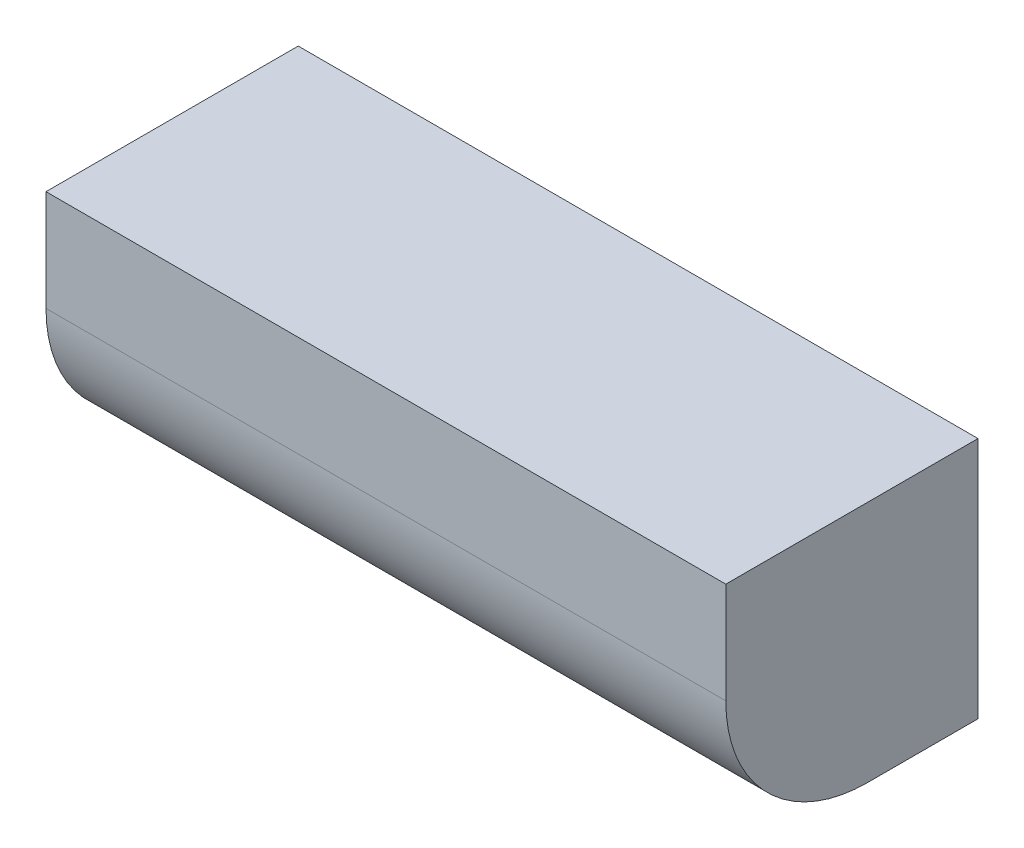
ISO-10303-21;
HEADER;
FILE_DESCRIPTION(('STEP AP214'),'2;1');
FILE_NAME('part.step','',(''),(''),'','','');
FILE_SCHEMA(('AUTOMOTIVE_DESIGN { 1 0 10303 214 1 1 1 1 }'));
ENDSEC;
DATA;
#1=APPLICATION_CONTEXT('core data for automotive mechanical design processes');
#2=APPLICATION_PROTOCOL_DEFINITION('international standard','automotive_design',2000,#1);
#3=PRODUCT_CONTEXT('',#1,'mechanical');
#4=PRODUCT('Part','Part','',(#3));
#5=PRODUCT_RELATED_PRODUCT_CATEGORY('part','',(#4));
#6=PRODUCT_DEFINITION_FORMATION('','',#4);
#7=PRODUCT_DEFINITION_CONTEXT('part definition',#1,'design');
#8=PRODUCT_DEFINITION('design','',#6,#7);
#9=PRODUCT_DEFINITION_SHAPE('','',#8);
#10=(LENGTH_UNIT() NAMED_UNIT(*) SI_UNIT(.MILLI.,.METRE.));
#11=(NAMED_UNIT(*) PLANE_ANGLE_UNIT() SI_UNIT($,.RADIAN.));
#12=(NAMED_UNIT(*) SI_UNIT($,.STERADIAN.) SOLID_ANGLE_UNIT());
#13=UNCERTAINTY_MEASURE_WITH_UNIT(LENGTH_MEASURE(1.E-05),#10,'distance_accuracy_value','');
#14=(GEOMETRIC_REPRESENTATION_CONTEXT(3) GLOBAL_UNCERTAINTY_ASSIGNED_CONTEXT((#13)) GLOBAL_UNIT_ASSIGNED_CONTEXT((#10,
#11,#12)) REPRESENTATION_CONTEXT('',''));
#15=CARTESIAN_POINT('',(0.,0.,0.));
#16=DIRECTION('',(0.,0.,1.));
#17=DIRECTION('',(1.,0.,0.));
#18=AXIS2_PLACEMENT_3D('',#15,#16,#17);
#19=CARTESIAN_POINT('',(0.,0.,10.));
#20=DIRECTION('',(1.,0.,0.));
#21=DIRECTION('',(0.,0.,-1.));
#22=AXIS2_PLACEMENT_3D('',#19,#20,#21);
#23=PLANE('',#22);
#24=DIRECTION('',(0.,0.,-1.));
#25=VECTOR('',#24,1.);
#26=CARTESIAN_POINT('',(0.,10.8609375,-17.8082122));
#27=LINE('',#26,#25);
#28=CARTESIAN_POINT('',(0.,10.8609375,-10.));
#29=VERTEX_POINT('',#28);
#30=CARTESIAN_POINT('',(0.,10.8609375,-17.8082122));
#31=VERTEX_POINT('',#30);
#32=EDGE_CURVE('E107',#29,#31,#27,.T.);
#33=ORIENTED_EDGE('',*,*,#32,.F.);
#34=CARTESIAN_POINT('',(0.,20.8609375,-10.));
#35=DIRECTION('',(1.,0.,0.));
#36=DIRECTION('',(0.,0.,-1.));
#37=AXIS2_PLACEMENT_3D('',#34,#35,#36);
#38=CIRCLE('',#37,10.);
#39=CARTESIAN_POINT('',(0.,20.8609374999999,0.));
#40=VERTEX_POINT('',#39);
#41=EDGE_CURVE('E93',#40,#29,#38,.T.);
#42=ORIENTED_EDGE('',*,*,#41,.F.);
#43=DIRECTION('',(0.,-1.,0.));
#44=VECTOR('',#43,1.);
#45=CARTESIAN_POINT('',(0.,28.,0.));
#46=LINE('',#45,#44);
#47=CARTESIAN_POINT('',(0.,28.,0.));
#48=VERTEX_POINT('',#47);
#49=EDGE_CURVE('E80',#48,#40,#46,.T.);
#50=ORIENTED_EDGE('',*,*,#49,.F.);
#51=DIRECTION('',(0.,0.,-1.));
#52=VECTOR('',#51,1.);
#53=CARTESIAN_POINT('',(0.,28.,-17.8082122));
#54=LINE('',#53,#52);
#55=CARTESIAN_POINT('',(0.,28.,-17.8082122));
#56=VERTEX_POINT('',#55);
#57=EDGE_CURVE('E86',#48,#56,#54,.T.);
#58=ORIENTED_EDGE('',*,*,#57,.T.);
#59=DIRECTION('',(0.,1.,0.));
#60=VECTOR('',#59,1.);
#61=CARTESIAN_POINT('',(0.,10.8609375,-17.8082122));
#62=LINE('',#61,#60);
#63=EDGE_CURVE('E11',#31,#56,#62,.T.);
#64=ORIENTED_EDGE('',*,*,#63,.F.);
#65=EDGE_LOOP('',(#33,#42,#50,#58,#64));
#66=FACE_BOUND('',#65,.T.);
#67=ADVANCED_FACE('F33',(#66),#23,.F.);
#68=CARTESIAN_POINT('',(48.,0.,10.));
#69=DIRECTION('',(-1.,0.,0.));
#70=DIRECTION('',(0.,0.,1.));
#71=AXIS2_PLACEMENT_3D('',#68,#69,#70);
#72=PLANE('',#71);
#73=DIRECTION('',(0.,0.,-1.));
#74=VECTOR('',#73,1.);
#75=CARTESIAN_POINT('',(48.,10.8609375,-17.8082122));
#76=LINE('',#75,#74);
#77=CARTESIAN_POINT('',(48.,10.8609375,-10.));
#78=VERTEX_POINT('',#77);
#79=CARTESIAN_POINT('',(48.,10.8609375,-17.8082122));
#80=VERTEX_POINT('',#79);
#81=EDGE_CURVE('E94',#78,#80,#76,.T.);
#82=ORIENTED_EDGE('',*,*,#81,.T.);
#83=DIRECTION('',(0.,-1.,0.));
#84=VECTOR('',#83,1.);
#85=CARTESIAN_POINT('',(48.,10.8609375,-17.8082122));
#86=LINE('',#85,#84);
#87=CARTESIAN_POINT('',(48.,28.,-17.8082122));
#88=VERTEX_POINT('',#87);
#89=EDGE_CURVE('E36',#88,#80,#86,.T.);
#90=ORIENTED_EDGE('',*,*,#89,.F.);
#91=DIRECTION('',(0.,0.,1.));
#92=VECTOR('',#91,1.);
#93=CARTESIAN_POINT('',(48.,28.,-17.8082122));
#94=LINE('',#93,#92);
#95=CARTESIAN_POINT('',(48.,28.,0.));
#96=VERTEX_POINT('',#95);
#97=EDGE_CURVE('E100',#88,#96,#94,.T.);
#98=ORIENTED_EDGE('',*,*,#97,.T.);
#99=DIRECTION('',(0.,-1.,0.));
#100=VECTOR('',#99,1.);
#101=CARTESIAN_POINT('',(48.,28.,0.));
#102=LINE('',#101,#100);
#103=CARTESIAN_POINT('',(48.,20.8609374999999,0.));
#104=VERTEX_POINT('',#103);
#105=EDGE_CURVE('E53',#96,#104,#102,.T.);
#106=ORIENTED_EDGE('',*,*,#105,.T.);
#107=CARTESIAN_POINT('',(48.,20.8609375,-10.));
#108=DIRECTION('',(1.,0.,0.));
#109=DIRECTION('',(0.,0.,-1.));
#110=AXIS2_PLACEMENT_3D('',#107,#108,#109);
#111=CIRCLE('',#110,10.);
#112=EDGE_CURVE('E112',#104,#78,#111,.T.);
#113=ORIENTED_EDGE('',*,*,#112,.T.);
#114=EDGE_LOOP('',(#82,#90,#98,#106,#113));
#115=FACE_BOUND('',#114,.T.);
#116=ADVANCED_FACE('F125',(#115),#72,.F.);
#117=CARTESIAN_POINT('',(-17.2191805697573,10.8609375,-17.8082122));
#118=DIRECTION('',(0.,0.,1.));
#119=DIRECTION('',(0.,-1.,0.));
#120=AXIS2_PLACEMENT_3D('',#117,#118,#119);
#121=PLANE('',#120);
#122=DIRECTION('',(1.,0.,0.));
#123=VECTOR('',#122,1.);
#124=CARTESIAN_POINT('',(0.,10.8609375,-17.8082122));
#125=LINE('',#124,#123);
#126=EDGE_CURVE('E103',#31,#80,#125,.T.);
#127=ORIENTED_EDGE('',*,*,#126,.F.);
#128=ORIENTED_EDGE('',*,*,#63,.T.);
#129=DIRECTION('',(1.,0.,0.));
#130=VECTOR('',#129,1.);
#131=CARTESIAN_POINT('',(-24.7159844056258,28.,-17.8082122));
#132=LINE('',#131,#130);
#133=EDGE_CURVE('E87',#56,#88,#132,.T.);
#134=ORIENTED_EDGE('',*,*,#133,.T.);
#135=ORIENTED_EDGE('',*,*,#89,.T.);
#136=EDGE_LOOP('',(#127,#128,#134,#135));
#137=FACE_BOUND('',#136,.T.);
#138=ADVANCED_FACE('F123',(#137),#121,.F.);
#139=CARTESIAN_POINT('',(-24.7159844056258,28.,-17.8082122));
#140=DIRECTION('',(0.,1.,0.));
#141=DIRECTION('',(0.,0.,1.));
#142=AXIS2_PLACEMENT_3D('',#139,#140,#141);
#143=PLANE('',#142);
#144=ORIENTED_EDGE('',*,*,#57,.F.);
#145=DIRECTION('',(1.,0.,0.));
#146=VECTOR('',#145,1.);
#147=CARTESIAN_POINT('',(-24.7159844056258,28.,0.));
#148=LINE('',#147,#146);
#149=EDGE_CURVE('E77',#48,#96,#148,.T.);
#150=ORIENTED_EDGE('',*,*,#149,.T.);
#151=ORIENTED_EDGE('',*,*,#97,.F.);
#152=ORIENTED_EDGE('',*,*,#133,.F.);
#153=EDGE_LOOP('',(#144,#150,#151,#152));
#154=FACE_BOUND('',#153,.T.);
#155=ADVANCED_FACE('F96',(#154),#143,.T.);
#156=CARTESIAN_POINT('',(0.,10.8609375,-17.8082122));
#157=DIRECTION('',(0.,-1.,0.));
#158=DIRECTION('',(0.,0.,-1.));
#159=AXIS2_PLACEMENT_3D('',#156,#157,#158);
#160=PLANE('',#159);
#161=ORIENTED_EDGE('',*,*,#81,.F.);
#162=DIRECTION('',(1.,0.,0.));
#163=VECTOR('',#162,1.);
#164=CARTESIAN_POINT('',(0.,10.8609375,-10.));
#165=LINE('',#164,#163);
#166=EDGE_CURVE('E106',#29,#78,#165,.T.);
#167=ORIENTED_EDGE('',*,*,#166,.F.);
#168=ORIENTED_EDGE('',*,*,#32,.T.);
#169=ORIENTED_EDGE('',*,*,#126,.T.);
#170=EDGE_LOOP('',(#161,#167,#168,#169));
#171=FACE_BOUND('',#170,.T.);
#172=ADVANCED_FACE('F122',(#171),#160,.T.);
#173=CARTESIAN_POINT('',(0.,20.8609375,-10.));
#174=DIRECTION('',(1.,0.,0.));
#175=DIRECTION('',(0.,0.,-1.));
#176=AXIS2_PLACEMENT_3D('',#173,#174,#175);
#177=CYLINDRICAL_SURFACE('',#176,10.);
#178=ORIENTED_EDGE('',*,*,#112,.F.);
#179=DIRECTION('',(1.,0.,0.));
#180=VECTOR('',#179,1.);
#181=CARTESIAN_POINT('',(0.,20.8609374999999,0.));
#182=LINE('',#181,#180);
#183=EDGE_CURVE('E104',#40,#104,#182,.T.);
#184=ORIENTED_EDGE('',*,*,#183,.F.);
#185=ORIENTED_EDGE('',*,*,#41,.T.);
#186=ORIENTED_EDGE('',*,*,#166,.T.);
#187=EDGE_LOOP('',(#178,#184,#185,#186));
#188=FACE_BOUND('',#187,.T.);
#189=ADVANCED_FACE('F119',(#188),#177,.T.);
#190=CARTESIAN_POINT('',(0.,28.,0.));
#191=DIRECTION('',(0.,0.,1.));
#192=DIRECTION('',(0.,-1.,0.));
#193=AXIS2_PLACEMENT_3D('',#190,#191,#192);
#194=PLANE('',#193);
#195=ORIENTED_EDGE('',*,*,#105,.F.);
#196=ORIENTED_EDGE('',*,*,#149,.F.);
#197=ORIENTED_EDGE('',*,*,#49,.T.);
#198=ORIENTED_EDGE('',*,*,#183,.T.);
#199=EDGE_LOOP('',(#195,#196,#197,#198));
#200=FACE_BOUND('',#199,.T.);
#201=ADVANCED_FACE('F79',(#200),#194,.T.);
#202=CLOSED_SHELL('',(#67,#116,#138,#155,#172,#189,#201));
#203=MANIFOLD_SOLID_BREP('B2',#202);
#204=ADVANCED_BREP_SHAPE_REPRESENTATION('',(#18,#203),#14);
#205=SHAPE_DEFINITION_REPRESENTATION(#9,#204);
ENDSEC;
END-ISO-10303-21;
